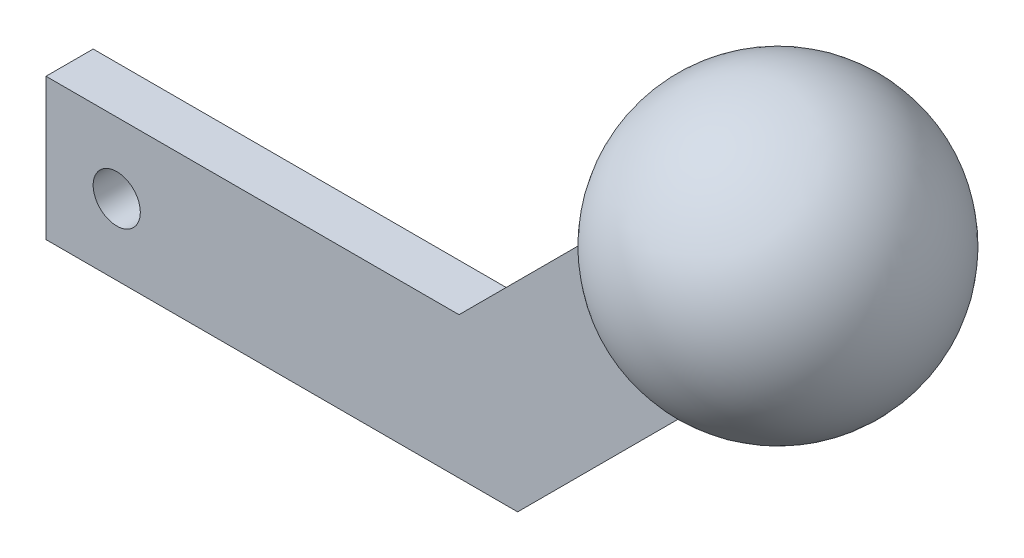
ISO-10303-21;
HEADER;
FILE_DESCRIPTION(('STEP AP214'),'2;1');
FILE_NAME('part.step','',(''),(''),'','','');
FILE_SCHEMA(('AUTOMOTIVE_DESIGN { 1 0 10303 214 1 1 1 1 }'));
ENDSEC;
DATA;
#1=APPLICATION_CONTEXT('core data for automotive mechanical design processes');
#2=APPLICATION_PROTOCOL_DEFINITION('international standard','automotive_design',2000,#1);
#3=PRODUCT_CONTEXT('',#1,'mechanical');
#4=PRODUCT('Part','Part','',(#3));
#5=PRODUCT_RELATED_PRODUCT_CATEGORY('part','',(#4));
#6=PRODUCT_DEFINITION_FORMATION('','',#4);
#7=PRODUCT_DEFINITION_CONTEXT('part definition',#1,'design');
#8=PRODUCT_DEFINITION('design','',#6,#7);
#9=PRODUCT_DEFINITION_SHAPE('','',#8);
#10=(LENGTH_UNIT() NAMED_UNIT(*) SI_UNIT(.MILLI.,.METRE.));
#11=(NAMED_UNIT(*) PLANE_ANGLE_UNIT() SI_UNIT($,.RADIAN.));
#12=(NAMED_UNIT(*) SI_UNIT($,.STERADIAN.) SOLID_ANGLE_UNIT());
#13=UNCERTAINTY_MEASURE_WITH_UNIT(LENGTH_MEASURE(1.E-05),#10,'distance_accuracy_value','');
#14=(GEOMETRIC_REPRESENTATION_CONTEXT(3) GLOBAL_UNCERTAINTY_ASSIGNED_CONTEXT((#13)) GLOBAL_UNIT_ASSIGNED_CONTEXT((#10,
#11,#12)) REPRESENTATION_CONTEXT('',''));
#15=CARTESIAN_POINT('',(0.,0.,0.));
#16=DIRECTION('',(0.,0.,1.));
#17=DIRECTION('',(1.,0.,0.));
#18=AXIS2_PLACEMENT_3D('',#15,#16,#17);
#19=CARTESIAN_POINT('',(71.2132034355964,21.2132034355965,5.));
#20=DIRECTION('',(-0.707106781186546,-0.707106781186549,0.));
#21=DIRECTION('',(0.707106781186549,-0.707106781186546,0.));
#22=AXIS2_PLACEMENT_3D('',#19,#20,#21);
#23=PLANE('',#22);
#24=DIRECTION('',(-0.707106781186549,0.707106781186546,0.));
#25=VECTOR('',#24,1.);
#26=CARTESIAN_POINT('',(71.2132034355964,21.2132034355965,5.));
#27=LINE('',#26,#25);
#28=CARTESIAN_POINT('',(60.9099025766973,31.5165042944955,5.));
#29=VERTEX_POINT('',#28);
#30=CARTESIAN_POINT('',(60.6066017177981,31.8198051533947,5.));
#31=VERTEX_POINT('',#30);
#32=EDGE_CURVE('E102',#29,#31,#27,.T.);
#33=ORIENTED_EDGE('',*,*,#32,.F.);
#34=CARTESIAN_POINT('',(65.9099025766973,26.5165042944956,2.5));
#35=DIRECTION('',(-0.707106781186546,-0.707106781186549,0.));
#36=DIRECTION('',(0.707106781186549,-0.707106781186546,0.));
#37=AXIS2_PLACEMENT_3D('',#34,#35,#36);
#38=CIRCLE('',#37,7.49999999999999);
#39=CARTESIAN_POINT('',(60.6066017177981,31.8198051533947,2.5));
#40=VERTEX_POINT('',#39);
#41=EDGE_CURVE('E122',#29,#40,#38,.T.);
#42=ORIENTED_EDGE('',*,*,#41,.T.);
#43=DIRECTION('',(0.,0.,-1.));
#44=VECTOR('',#43,1.);
#45=CARTESIAN_POINT('',(60.6066017177981,31.8198051533947,5.));
#46=LINE('',#45,#44);
#47=EDGE_CURVE('E119',#31,#40,#46,.T.);
#48=ORIENTED_EDGE('',*,*,#47,.F.);
#49=EDGE_LOOP('',(#33,#42,#48));
#50=FACE_BOUND('',#49,.T.);
#51=ADVANCED_FACE('F33',(#50),#23,.F.);
#52=CARTESIAN_POINT('',(60.6066017177981,31.8198051533947,0.));
#53=VERTEX_POINT('',#52);
#54=EDGE_CURVE('E127',#40,#53,#46,.T.);
#55=ORIENTED_EDGE('',*,*,#54,.F.);
#56=CARTESIAN_POINT('',(60.9099025766973,31.5165042944955,0.));
#57=VERTEX_POINT('',#56);
#58=EDGE_CURVE('E331',#40,#57,#38,.T.);
#59=ORIENTED_EDGE('',*,*,#58,.T.);
#60=DIRECTION('',(-0.707106781186549,0.707106781186546,0.));
#61=VECTOR('',#60,1.);
#62=CARTESIAN_POINT('',(71.2132034355964,21.2132034355965,0.));
#63=LINE('',#62,#61);
#64=EDGE_CURVE('E145',#57,#53,#63,.T.);
#65=ORIENTED_EDGE('',*,*,#64,.T.);
#66=EDGE_LOOP('',(#55,#59,#65));
#67=FACE_BOUND('',#66,.T.);
#68=ADVANCED_FACE('F214',(#67),#23,.F.);
#69=DIRECTION('',(0.,0.,-1.));
#70=VECTOR('',#69,1.);
#71=CARTESIAN_POINT('',(71.2132034355964,21.2132034355965,5.));
#72=LINE('',#71,#70);
#73=CARTESIAN_POINT('',(71.2132034355964,21.2132034355965,5.));
#74=VERTEX_POINT('',#73);
#75=CARTESIAN_POINT('',(71.2132034355964,21.2132034355965,2.5));
#76=VERTEX_POINT('',#75);
#77=EDGE_CURVE('E155',#74,#76,#72,.T.);
#78=ORIENTED_EDGE('',*,*,#77,.T.);
#79=CARTESIAN_POINT('',(70.9099025766973,21.5165042944956,5.));
#80=VERTEX_POINT('',#79);
#81=EDGE_CURVE('E48',#76,#80,#38,.T.);
#82=ORIENTED_EDGE('',*,*,#81,.T.);
#83=EDGE_CURVE('E115',#74,#80,#27,.T.);
#84=ORIENTED_EDGE('',*,*,#83,.F.);
#85=EDGE_LOOP('',(#78,#82,#84));
#86=FACE_BOUND('',#85,.T.);
#87=ADVANCED_FACE('F195',(#86),#23,.F.);
#88=CARTESIAN_POINT('',(0.,0.,5.));
#89=DIRECTION('',(0.,0.,1.));
#90=DIRECTION('',(1.,0.,0.));
#91=AXIS2_PLACEMENT_3D('',#88,#89,#90);
#92=PLANE('',#91);
#93=DIRECTION('',(0.,-1.,0.));
#94=VECTOR('',#93,1.);
#95=CARTESIAN_POINT('',(0.,15.,5.));
#96=LINE('',#95,#94);
#97=CARTESIAN_POINT('',(0.,15.,5.));
#98=VERTEX_POINT('',#97);
#99=CARTESIAN_POINT('',(0.,0.,5.));
#100=VERTEX_POINT('',#99);
#101=EDGE_CURVE('E152',#98,#100,#96,.T.);
#102=ORIENTED_EDGE('',*,*,#101,.T.);
#103=DIRECTION('',(1.,0.,0.));
#104=VECTOR('',#103,1.);
#105=CARTESIAN_POINT('',(0.,0.,5.));
#106=LINE('',#105,#104);
#107=CARTESIAN_POINT('',(50.,0.,5.));
#108=VERTEX_POINT('',#107);
#109=EDGE_CURVE('E92',#100,#108,#106,.T.);
#110=ORIENTED_EDGE('',*,*,#109,.T.);
#111=DIRECTION('',(0.707106781186546,0.707106781186549,0.));
#112=VECTOR('',#111,1.);
#113=CARTESIAN_POINT('',(50.,0.,5.));
#114=LINE('',#113,#112);
#115=EDGE_CURVE('E116',#108,#74,#114,.T.);
#116=ORIENTED_EDGE('',*,*,#115,.T.);
#117=ORIENTED_EDGE('',*,*,#83,.T.);
#118=DIRECTION('',(0.707106781186549,-0.707106781186546,0.));
#119=VECTOR('',#118,1.);
#120=CARTESIAN_POINT('',(46.2132034355963,46.2132034355965,5.));
#121=LINE('',#120,#119);
#122=EDGE_CURVE('E112',#29,#80,#121,.T.);
#123=ORIENTED_EDGE('',*,*,#122,.F.);
#124=ORIENTED_EDGE('',*,*,#32,.T.);
#125=DIRECTION('',(-0.707106781186546,-0.707106781186549,0.));
#126=VECTOR('',#125,1.);
#127=CARTESIAN_POINT('',(60.6066017177981,31.8198051533947,5.));
#128=LINE('',#127,#126);
#129=CARTESIAN_POINT('',(43.7867965644036,15.,5.));
#130=VERTEX_POINT('',#129);
#131=EDGE_CURVE('E107',#31,#130,#128,.T.);
#132=ORIENTED_EDGE('',*,*,#131,.T.);
#133=DIRECTION('',(-1.,0.,0.));
#134=VECTOR('',#133,1.);
#135=CARTESIAN_POINT('',(43.7867965644036,15.,5.));
#136=LINE('',#135,#134);
#137=EDGE_CURVE('E57',#130,#98,#136,.T.);
#138=ORIENTED_EDGE('',*,*,#137,.T.);
#139=EDGE_LOOP('',(#102,#110,#116,#117,#123,#124,#132,#138));
#140=FACE_BOUND('',#139,.T.);
#141=CARTESIAN_POINT('',(7.5,7.49999999999999,5.));
#142=DIRECTION('',(0.,0.,1.));
#143=DIRECTION('',(1.,0.,0.));
#144=AXIS2_PLACEMENT_3D('',#141,#142,#143);
#145=CIRCLE('',#144,2.5);
#146=CARTESIAN_POINT('',(10.,7.49999999999999,5.));
#147=VERTEX_POINT('',#146);
#148=EDGE_CURVE('E140',#147,#147,#145,.T.);
#149=ORIENTED_EDGE('',*,*,#148,.F.);
#150=EDGE_LOOP('',(#149));
#151=FACE_BOUND('',#150,.T.);
#152=ADVANCED_FACE('F104',(#140,#151),#92,.T.);
#153=CARTESIAN_POINT('',(0.,0.,0.));
#154=DIRECTION('',(0.,0.,1.));
#155=DIRECTION('',(1.,0.,0.));
#156=AXIS2_PLACEMENT_3D('',#153,#154,#155);
#157=PLANE('',#156);
#158=DIRECTION('',(0.,-1.,0.));
#159=VECTOR('',#158,1.);
#160=CARTESIAN_POINT('',(0.,15.,0.));
#161=LINE('',#160,#159);
#162=CARTESIAN_POINT('',(0.,15.,0.));
#163=VERTEX_POINT('',#162);
#164=CARTESIAN_POINT('',(0.,0.,0.));
#165=VERTEX_POINT('',#164);
#166=EDGE_CURVE('E136',#163,#165,#161,.T.);
#167=ORIENTED_EDGE('',*,*,#166,.F.);
#168=DIRECTION('',(-1.,0.,0.));
#169=VECTOR('',#168,1.);
#170=CARTESIAN_POINT('',(43.7867965644036,15.,0.));
#171=LINE('',#170,#169);
#172=CARTESIAN_POINT('',(43.7867965644036,15.,0.));
#173=VERTEX_POINT('',#172);
#174=EDGE_CURVE('E84',#173,#163,#171,.T.);
#175=ORIENTED_EDGE('',*,*,#174,.F.);
#176=DIRECTION('',(-0.707106781186546,-0.707106781186549,0.));
#177=VECTOR('',#176,1.);
#178=CARTESIAN_POINT('',(60.6066017177981,31.8198051533947,0.));
#179=LINE('',#178,#177);
#180=EDGE_CURVE('E149',#53,#173,#179,.T.);
#181=ORIENTED_EDGE('',*,*,#180,.F.);
#182=ORIENTED_EDGE('',*,*,#64,.F.);
#183=DIRECTION('',(0.707106781186549,-0.707106781186546,0.));
#184=VECTOR('',#183,1.);
#185=CARTESIAN_POINT('',(46.2132034355963,46.2132034355965,0.));
#186=LINE('',#185,#184);
#187=CARTESIAN_POINT('',(70.9099025766973,21.5165042944956,0.));
#188=VERTEX_POINT('',#187);
#189=EDGE_CURVE('E172',#57,#188,#186,.T.);
#190=ORIENTED_EDGE('',*,*,#189,.T.);
#191=CARTESIAN_POINT('',(71.2132034355964,21.2132034355965,0.));
#192=VERTEX_POINT('',#191);
#193=EDGE_CURVE('E146',#192,#188,#63,.T.);
#194=ORIENTED_EDGE('',*,*,#193,.F.);
#195=DIRECTION('',(0.707106781186546,0.707106781186549,0.));
#196=VECTOR('',#195,1.);
#197=CARTESIAN_POINT('',(50.,0.,0.));
#198=LINE('',#197,#196);
#199=CARTESIAN_POINT('',(50.,0.,0.));
#200=VERTEX_POINT('',#199);
#201=EDGE_CURVE('E142',#200,#192,#198,.T.);
#202=ORIENTED_EDGE('',*,*,#201,.F.);
#203=DIRECTION('',(1.,0.,0.));
#204=VECTOR('',#203,1.);
#205=CARTESIAN_POINT('',(0.,0.,0.));
#206=LINE('',#205,#204);
#207=EDGE_CURVE('E139',#165,#200,#206,.T.);
#208=ORIENTED_EDGE('',*,*,#207,.F.);
#209=EDGE_LOOP('',(#167,#175,#181,#182,#190,#194,#202,#208));
#210=FACE_BOUND('',#209,.T.);
#211=CARTESIAN_POINT('',(7.5,7.49999999999999,0.));
#212=DIRECTION('',(0.,0.,1.));
#213=DIRECTION('',(1.,0.,0.));
#214=AXIS2_PLACEMENT_3D('',#211,#212,#213);
#215=CIRCLE('',#214,2.5);
#216=CARTESIAN_POINT('',(10.,7.49999999999999,0.));
#217=VERTEX_POINT('',#216);
#218=EDGE_CURVE('E189',#217,#217,#215,.T.);
#219=ORIENTED_EDGE('',*,*,#218,.T.);
#220=EDGE_LOOP('',(#219));
#221=FACE_BOUND('',#220,.T.);
#222=ADVANCED_FACE('F167',(#210,#221),#157,.F.);
#223=CARTESIAN_POINT('',(0.,15.,5.));
#224=DIRECTION('',(1.,0.,0.));
#225=DIRECTION('',(0.,1.,0.));
#226=AXIS2_PLACEMENT_3D('',#223,#224,#225);
#227=PLANE('',#226);
#228=ORIENTED_EDGE('',*,*,#166,.T.);
#229=DIRECTION('',(0.,0.,-1.));
#230=VECTOR('',#229,1.);
#231=CARTESIAN_POINT('',(0.,0.,5.));
#232=LINE('',#231,#230);
#233=EDGE_CURVE('E11',#100,#165,#232,.T.);
#234=ORIENTED_EDGE('',*,*,#233,.F.);
#235=ORIENTED_EDGE('',*,*,#101,.F.);
#236=DIRECTION('',(0.,0.,-1.));
#237=VECTOR('',#236,1.);
#238=CARTESIAN_POINT('',(0.,15.,5.));
#239=LINE('',#238,#237);
#240=EDGE_CURVE('E132',#98,#163,#239,.T.);
#241=ORIENTED_EDGE('',*,*,#240,.T.);
#242=EDGE_LOOP('',(#228,#234,#235,#241));
#243=FACE_BOUND('',#242,.T.);
#244=ADVANCED_FACE('F35',(#243),#227,.F.);
#245=CARTESIAN_POINT('',(0.,0.,5.));
#246=DIRECTION('',(0.,1.,0.));
#247=DIRECTION('',(0.,0.,1.));
#248=AXIS2_PLACEMENT_3D('',#245,#246,#247);
#249=PLANE('',#248);
#250=ORIENTED_EDGE('',*,*,#207,.T.);
#251=DIRECTION('',(0.,0.,-1.));
#252=VECTOR('',#251,1.);
#253=CARTESIAN_POINT('',(50.,0.,5.));
#254=LINE('',#253,#252);
#255=EDGE_CURVE('E41',#108,#200,#254,.T.);
#256=ORIENTED_EDGE('',*,*,#255,.F.);
#257=ORIENTED_EDGE('',*,*,#109,.F.);
#258=ORIENTED_EDGE('',*,*,#233,.T.);
#259=EDGE_LOOP('',(#250,#256,#257,#258));
#260=FACE_BOUND('',#259,.T.);
#261=ADVANCED_FACE('F230',(#260),#249,.F.);
#262=CARTESIAN_POINT('',(50.,0.,5.));
#263=DIRECTION('',(-0.707106781186549,0.707106781186546,0.));
#264=DIRECTION('',(-0.707106781186546,-0.707106781186549,0.));
#265=AXIS2_PLACEMENT_3D('',#262,#263,#264);
#266=PLANE('',#265);
#267=ORIENTED_EDGE('',*,*,#201,.T.);
#268=EDGE_CURVE('E126',#76,#192,#72,.T.);
#269=ORIENTED_EDGE('',*,*,#268,.F.);
#270=ORIENTED_EDGE('',*,*,#77,.F.);
#271=ORIENTED_EDGE('',*,*,#115,.F.);
#272=ORIENTED_EDGE('',*,*,#255,.T.);
#273=EDGE_LOOP('',(#267,#269,#270,#271,#272));
#274=FACE_BOUND('',#273,.T.);
#275=ADVANCED_FACE('F161',(#274),#266,.F.);
#276=ORIENTED_EDGE('',*,*,#193,.T.);
#277=EDGE_CURVE('E175',#188,#76,#38,.T.);
#278=ORIENTED_EDGE('',*,*,#277,.T.);
#279=ORIENTED_EDGE('',*,*,#268,.T.);
#280=EDGE_LOOP('',(#276,#278,#279));
#281=FACE_BOUND('',#280,.T.);
#282=ADVANCED_FACE('F174',(#281),#23,.F.);
#283=CARTESIAN_POINT('',(60.6066017177981,31.8198051533947,5.));
#284=DIRECTION('',(0.707106781186549,-0.707106781186546,0.));
#285=DIRECTION('',(0.707106781186546,0.707106781186549,0.));
#286=AXIS2_PLACEMENT_3D('',#283,#284,#285);
#287=PLANE('',#286);
#288=ORIENTED_EDGE('',*,*,#180,.T.);
#289=DIRECTION('',(0.,0.,-1.));
#290=VECTOR('',#289,1.);
#291=CARTESIAN_POINT('',(43.7867965644036,15.,5.));
#292=LINE('',#291,#290);
#293=EDGE_CURVE('E130',#130,#173,#292,.T.);
#294=ORIENTED_EDGE('',*,*,#293,.F.);
#295=ORIENTED_EDGE('',*,*,#131,.F.);
#296=ORIENTED_EDGE('',*,*,#47,.T.);
#297=ORIENTED_EDGE('',*,*,#54,.T.);
#298=EDGE_LOOP('',(#288,#294,#295,#296,#297));
#299=FACE_BOUND('',#298,.T.);
#300=ADVANCED_FACE('F129',(#299),#287,.F.);
#301=CARTESIAN_POINT('',(43.7867965644036,15.,5.));
#302=DIRECTION('',(0.,-1.,0.));
#303=DIRECTION('',(1.,0.,0.));
#304=AXIS2_PLACEMENT_3D('',#301,#302,#303);
#305=PLANE('',#304);
#306=ORIENTED_EDGE('',*,*,#174,.T.);
#307=ORIENTED_EDGE('',*,*,#240,.F.);
#308=ORIENTED_EDGE('',*,*,#137,.F.);
#309=ORIENTED_EDGE('',*,*,#293,.T.);
#310=EDGE_LOOP('',(#306,#307,#308,#309));
#311=FACE_BOUND('',#310,.T.);
#312=ADVANCED_FACE('F229',(#311),#305,.F.);
#313=CARTESIAN_POINT('',(7.5,7.49999999999999,5.));
#314=DIRECTION('',(0.,0.,-1.));
#315=DIRECTION('',(-1.,0.,0.));
#316=AXIS2_PLACEMENT_3D('',#313,#314,#315);
#317=CYLINDRICAL_SURFACE('',#316,2.5);
#318=ORIENTED_EDGE('',*,*,#148,.T.);
#319=EDGE_LOOP('',(#318));
#320=FACE_BOUND('',#319,.T.);
#321=ORIENTED_EDGE('',*,*,#218,.F.);
#322=EDGE_LOOP('',(#321));
#323=FACE_BOUND('',#322,.T.);
#324=ADVANCED_FACE('F205',(#320,#323),#317,.F.);
#325=CARTESIAN_POINT('',(65.9099025766973,26.5165042944956,2.5));
#326=DIRECTION('',(-0.707106781186546,-0.707106781186549,0.));
#327=DIRECTION('',(0.707106781186549,-0.707106781186546,0.));
#328=AXIS2_PLACEMENT_3D('',#325,#326,#327);
#329=PLANE('',#328);
#330=ORIENTED_EDGE('',*,*,#189,.F.);
#331=EDGE_CURVE('E332',#57,#188,#38,.T.);
#332=ORIENTED_EDGE('',*,*,#331,.T.);
#333=EDGE_LOOP('',(#330,#332));
#334=FACE_BOUND('',#333,.T.);
#335=ADVANCED_FACE('F246',(#334),#329,.T.);
#336=EDGE_CURVE('E188',#80,#29,#38,.T.);
#337=ORIENTED_EDGE('',*,*,#336,.T.);
#338=ORIENTED_EDGE('',*,*,#122,.T.);
#339=EDGE_LOOP('',(#337,#338));
#340=FACE_BOUND('',#339,.T.);
#341=ADVANCED_FACE('F187',(#340),#329,.T.);
#342=CARTESIAN_POINT('',(75.0954891121342,35.7020908299325,2.5));
#343=DIRECTION('',(-0.707106781186546,-0.707106781186549,0.));
#344=DIRECTION('',(0.707106781186549,-0.707106781186546,0.));
#345=AXIS2_PLACEMENT_3D('',#342,#343,#344);
#346=SPHERICAL_SURFACE('',#345,15.);
#347=ORIENTED_EDGE('',*,*,#81,.F.);
#348=ORIENTED_EDGE('',*,*,#277,.F.);
#349=ORIENTED_EDGE('',*,*,#331,.F.);
#350=ORIENTED_EDGE('',*,*,#58,.F.);
#351=ORIENTED_EDGE('',*,*,#41,.F.);
#352=ORIENTED_EDGE('',*,*,#336,.F.);
#353=EDGE_LOOP('',(#347,#348,#349,#350,#351,#352));
#354=FACE_BOUND('',#353,.T.);
#355=ADVANCED_FACE('F191',(#354),#346,.T.);
#356=CLOSED_SHELL('',(#51,#68,#87,#152,#222,#244,#261,#275,#282,#300,#312,#324,#335,#341,#355));
#357=MANIFOLD_SOLID_BREP('B2',#356);
#358=ADVANCED_BREP_SHAPE_REPRESENTATION('',(#18,#357),#14);
#359=SHAPE_DEFINITION_REPRESENTATION(#9,#358);
ENDSEC;
END-ISO-10303-21;
